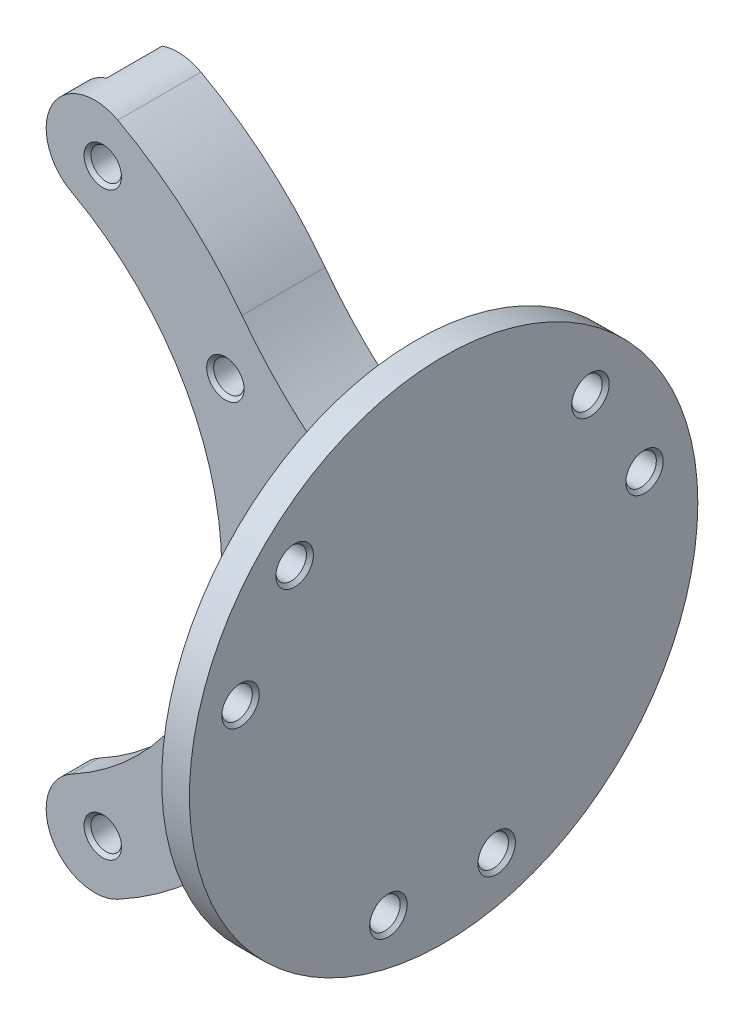
ISO-10303-21;
HEADER;
FILE_DESCRIPTION(('STEP AP214'),'2;1');
FILE_NAME('part.step','',(''),(''),'','','');
FILE_SCHEMA(('AUTOMOTIVE_DESIGN { 1 0 10303 214 1 1 1 1 }'));
ENDSEC;
DATA;
#1=APPLICATION_CONTEXT('core data for automotive mechanical design processes');
#2=APPLICATION_PROTOCOL_DEFINITION('international standard','automotive_design',2000,#1);
#3=PRODUCT_CONTEXT('',#1,'mechanical');
#4=PRODUCT('Part','Part','',(#3));
#5=PRODUCT_RELATED_PRODUCT_CATEGORY('part','',(#4));
#6=PRODUCT_DEFINITION_FORMATION('','',#4);
#7=PRODUCT_DEFINITION_CONTEXT('part definition',#1,'design');
#8=PRODUCT_DEFINITION('design','',#6,#7);
#9=PRODUCT_DEFINITION_SHAPE('','',#8);
#10=(LENGTH_UNIT() NAMED_UNIT(*) SI_UNIT(.MILLI.,.METRE.));
#11=(NAMED_UNIT(*) PLANE_ANGLE_UNIT() SI_UNIT($,.RADIAN.));
#12=(NAMED_UNIT(*) SI_UNIT($,.STERADIAN.) SOLID_ANGLE_UNIT());
#13=UNCERTAINTY_MEASURE_WITH_UNIT(LENGTH_MEASURE(1.E-05),#10,'distance_accuracy_value','');
#14=(GEOMETRIC_REPRESENTATION_CONTEXT(3) GLOBAL_UNCERTAINTY_ASSIGNED_CONTEXT((#13)) GLOBAL_UNIT_ASSIGNED_CONTEXT((#10,
#11,#12)) REPRESENTATION_CONTEXT('',''));
#15=CARTESIAN_POINT('',(0.,0.,0.));
#16=DIRECTION('',(0.,0.,1.));
#17=DIRECTION('',(1.,0.,0.));
#18=AXIS2_PLACEMENT_3D('',#15,#16,#17);
#19=CARTESIAN_POINT('',(0.,0.,3.));
#20=DIRECTION('',(0.,0.,-1.));
#21=DIRECTION('',(-1.,0.,0.));
#22=AXIS2_PLACEMENT_3D('',#19,#20,#21);
#23=CYLINDRICAL_SURFACE('',#22,41.5);
#24=DIRECTION('',(0.,0.,1.));
#25=VECTOR('',#24,1.);
#26=CARTESIAN_POINT('',(33.1863891259891,24.9181375062095,-6.));
#27=LINE('',#26,#25);
#28=CARTESIAN_POINT('',(33.1863891259891,24.9181375062095,-6.));
#29=VERTEX_POINT('',#28);
#30=CARTESIAN_POINT('',(33.1863891259898,24.9181375062099,3.));
#31=VERTEX_POINT('',#30);
#32=EDGE_CURVE('E151',#29,#31,#27,.T.);
#33=ORIENTED_EDGE('',*,*,#32,.F.);
#34=CARTESIAN_POINT('',(0.,0.,-6.));
#35=DIRECTION('',(0.,0.,1.));
#36=DIRECTION('',(1.,0.,0.));
#37=AXIS2_PLACEMENT_3D('',#34,#35,#36);
#38=CIRCLE('',#37,41.5);
#39=CARTESIAN_POINT('',(19.7507491807269,36.498738427513,-6.));
#40=VERTEX_POINT('',#39);
#41=EDGE_CURVE('E160',#29,#40,#38,.T.);
#42=ORIENTED_EDGE('',*,*,#41,.T.);
#43=DIRECTION('',(0.,0.,-1.));
#44=VECTOR('',#43,1.);
#45=CARTESIAN_POINT('',(19.7507491807269,36.498738427513,3.));
#46=LINE('',#45,#44);
#47=CARTESIAN_POINT('',(19.7507491807269,36.498738427513,3.));
#48=VERTEX_POINT('',#47);
#49=EDGE_CURVE('E276',#48,#40,#46,.T.);
#50=ORIENTED_EDGE('',*,*,#49,.F.);
#51=CARTESIAN_POINT('',(0.,0.,3.));
#52=DIRECTION('',(0.,0.,1.));
#53=DIRECTION('',(1.,0.,0.));
#54=AXIS2_PLACEMENT_3D('',#51,#52,#53);
#55=CIRCLE('',#54,41.5);
#56=EDGE_CURVE('E172',#31,#48,#55,.T.);
#57=ORIENTED_EDGE('',*,*,#56,.F.);
#58=EDGE_LOOP('',(#33,#42,#50,#57));
#59=FACE_BOUND('',#58,.T.);
#60=ADVANCED_FACE('F45',(#59),#23,.T.);
#61=CARTESIAN_POINT('',(0.,0.,0.));
#62=DIRECTION('',(0.,0.,1.));
#63=DIRECTION('',(1.,0.,0.));
#64=AXIS2_PLACEMENT_3D('',#61,#62,#63);
#65=PLANE('',#64);
#66=CARTESIAN_POINT('',(31.3934208871861,18.1249999999996,0.));
#67=DIRECTION('',(0.,0.,1.));
#68=DIRECTION('',(1.,0.,0.));
#69=AXIS2_PLACEMENT_3D('',#66,#67,#68);
#70=CIRCLE('',#69,1.65);
#71=CARTESIAN_POINT('',(33.0434208871861,18.1249999999996,0.));
#72=VERTEX_POINT('',#71);
#73=EDGE_CURVE('E189',#72,#72,#70,.T.);
#74=ORIENTED_EDGE('',*,*,#73,.T.);
#75=EDGE_LOOP('',(#74));
#76=FACE_BOUND('',#75,.T.);
#77=CARTESIAN_POINT('',(18.1250000000004,31.3934208871857,0.));
#78=DIRECTION('',(0.,0.,1.));
#79=DIRECTION('',(1.,0.,0.));
#80=AXIS2_PLACEMENT_3D('',#77,#78,#79);
#81=CIRCLE('',#80,1.64999999999999);
#82=CARTESIAN_POINT('',(19.7750000000004,31.3934208871857,0.));
#83=VERTEX_POINT('',#82);
#84=EDGE_CURVE('E198',#83,#83,#81,.T.);
#85=ORIENTED_EDGE('',*,*,#84,.T.);
#86=EDGE_LOOP('',(#85));
#87=FACE_BOUND('',#86,.T.);
#88=CARTESIAN_POINT('',(18.1249999999999,-31.3934208871859,0.));
#89=DIRECTION('',(0.,0.,1.));
#90=DIRECTION('',(1.,0.,0.));
#91=AXIS2_PLACEMENT_3D('',#88,#89,#90);
#92=CIRCLE('',#91,1.65);
#93=CARTESIAN_POINT('',(19.7749999999999,-31.3934208871859,0.));
#94=VERTEX_POINT('',#93);
#95=EDGE_CURVE('E207',#94,#94,#92,.T.);
#96=ORIENTED_EDGE('',*,*,#95,.T.);
#97=EDGE_LOOP('',(#96));
#98=FACE_BOUND('',#97,.T.);
#99=CARTESIAN_POINT('',(31.3934208871859,-18.125,0.));
#100=DIRECTION('',(0.,0.,1.));
#101=DIRECTION('',(1.,0.,0.));
#102=AXIS2_PLACEMENT_3D('',#99,#100,#101);
#103=CIRCLE('',#102,1.65);
#104=CARTESIAN_POINT('',(33.0434208871859,-18.125,0.));
#105=VERTEX_POINT('',#104);
#106=EDGE_CURVE('E216',#105,#105,#103,.T.);
#107=ORIENTED_EDGE('',*,*,#106,.T.);
#108=EDGE_LOOP('',(#107));
#109=FACE_BOUND('',#108,.T.);
#110=CARTESIAN_POINT('',(36.25,0.,0.));
#111=DIRECTION('',(0.,0.,1.));
#112=DIRECTION('',(1.,0.,0.));
#113=AXIS2_PLACEMENT_3D('',#110,#111,#112);
#114=CIRCLE('',#113,1.65);
#115=CARTESIAN_POINT('',(37.9,0.,0.));
#116=VERTEX_POINT('',#115);
#117=EDGE_CURVE('E225',#116,#116,#114,.T.);
#118=ORIENTED_EDGE('',*,*,#117,.T.);
#119=EDGE_LOOP('',(#118));
#120=FACE_BOUND('',#119,.T.);
#121=CARTESIAN_POINT('',(0.,0.,0.));
#122=DIRECTION('',(0.,0.,1.));
#123=DIRECTION('',(1.,0.,0.));
#124=AXIS2_PLACEMENT_3D('',#121,#122,#123);
#125=CIRCLE('',#124,40.);
#126=CARTESIAN_POINT('',(15.557724421526,-36.8504709715338,0.));
#127=VERTEX_POINT('',#126);
#128=CARTESIAN_POINT('',(15.5577244215262,36.8504709715337,0.));
#129=VERTEX_POINT('',#128);
#130=EDGE_CURVE('E229',#127,#129,#125,.T.);
#131=ORIENTED_EDGE('',*,*,#130,.F.);
#132=CARTESIAN_POINT('',(17.252160428948,-31.8814281445145,0.));
#133=DIRECTION('',(0.,0.,1.));
#134=DIRECTION('',(1.,0.,0.));
#135=AXIS2_PLACEMENT_3D('',#132,#133,#134);
#136=CIRCLE('',#135,5.25);
#137=CARTESIAN_POINT('',(14.7535716771693,-27.2641178615158,0.));
#138=VERTEX_POINT('',#137);
#139=EDGE_CURVE('E268',#138,#127,#136,.T.);
#140=ORIENTED_EDGE('',*,*,#139,.F.);
#141=CARTESIAN_POINT('',(0.,0.,0.));
#142=DIRECTION('',(0.,0.,1.));
#143=DIRECTION('',(1.,0.,0.));
#144=AXIS2_PLACEMENT_3D('',#141,#142,#143);
#145=CIRCLE('',#144,31.);
#146=CARTESIAN_POINT('',(14.7535716771695,27.2641178615158,0.));
#147=VERTEX_POINT('',#146);
#148=EDGE_CURVE('E244',#138,#147,#145,.T.);
#149=ORIENTED_EDGE('',*,*,#148,.T.);
#150=CARTESIAN_POINT('',(17.2521604289482,31.8814281445144,0.));
#151=DIRECTION('',(0.,0.,1.));
#152=DIRECTION('',(1.,0.,0.));
#153=AXIS2_PLACEMENT_3D('',#150,#151,#152);
#154=CIRCLE('',#153,5.25);
#155=EDGE_CURVE('E253',#147,#129,#154,.F.);
#156=ORIENTED_EDGE('',*,*,#155,.T.);
#157=EDGE_LOOP('',(#131,#140,#149,#156));
#158=FACE_BOUND('',#157,.T.);
#159=ADVANCED_FACE('F464',(#76,#87,#98,#109,#120,#158),#65,.F.);
#160=CARTESIAN_POINT('',(0.,0.,3.));
#161=DIRECTION('',(0.,0.,-1.));
#162=DIRECTION('',(-1.,0.,0.));
#163=AXIS2_PLACEMENT_3D('',#160,#161,#162);
#164=CYLINDRICAL_SURFACE('',#163,31.);
#165=ORIENTED_EDGE('',*,*,#148,.F.);
#166=DIRECTION('',(0.,0.,-1.));
#167=VECTOR('',#166,1.);
#168=CARTESIAN_POINT('',(14.7535716771693,-27.2641178615158,3.));
#169=LINE('',#168,#167);
#170=CARTESIAN_POINT('',(14.7535716771693,-27.2641178615158,3.));
#171=VERTEX_POINT('',#170);
#172=EDGE_CURVE('E282',#171,#138,#169,.T.);
#173=ORIENTED_EDGE('',*,*,#172,.F.);
#174=CARTESIAN_POINT('',(0.,0.,3.));
#175=DIRECTION('',(0.,0.,1.));
#176=DIRECTION('',(1.,0.,0.));
#177=AXIS2_PLACEMENT_3D('',#174,#175,#176);
#178=CIRCLE('',#177,31.);
#179=CARTESIAN_POINT('',(14.7535716771695,27.2641178615158,3.));
#180=VERTEX_POINT('',#179);
#181=EDGE_CURVE('E248',#171,#180,#178,.T.);
#182=ORIENTED_EDGE('',*,*,#181,.T.);
#183=DIRECTION('',(0.,0.,-1.));
#184=VECTOR('',#183,1.);
#185=CARTESIAN_POINT('',(14.7535716771695,27.2641178615158,3.));
#186=LINE('',#185,#184);
#187=EDGE_CURVE('E264',#180,#147,#186,.T.);
#188=ORIENTED_EDGE('',*,*,#187,.T.);
#189=EDGE_LOOP('',(#165,#173,#182,#188));
#190=FACE_BOUND('',#189,.T.);
#191=ADVANCED_FACE('F470',(#190),#164,.F.);
#192=CARTESIAN_POINT('',(17.252160428948,-31.8814281445145,3.));
#193=DIRECTION('',(0.,0.,-1.));
#194=DIRECTION('',(-1.,0.,0.));
#195=AXIS2_PLACEMENT_3D('',#192,#193,#194);
#196=CYLINDRICAL_SURFACE('',#195,5.25);
#197=ORIENTED_EDGE('',*,*,#139,.T.);
#198=DIRECTION('',(0.,0.,1.));
#199=VECTOR('',#198,1.);
#200=CARTESIAN_POINT('',(15.557724421526,-36.8504709715338,-6.));
#201=LINE('',#200,#199);
#202=CARTESIAN_POINT('',(15.557724421526,-36.8504709715338,-6.));
#203=VERTEX_POINT('',#202);
#204=EDGE_CURVE('E236',#203,#127,#201,.T.);
#205=ORIENTED_EDGE('',*,*,#204,.F.);
#206=CARTESIAN_POINT('',(17.252160428948,-31.8814281445145,-6.));
#207=DIRECTION('',(0.,0.,1.));
#208=DIRECTION('',(1.,0.,0.));
#209=AXIS2_PLACEMENT_3D('',#206,#207,#208);
#210=CIRCLE('',#209,5.25);
#211=CARTESIAN_POINT('',(19.7507491807267,-36.4987384275131,-6.));
#212=VERTEX_POINT('',#211);
#213=EDGE_CURVE('E169',#203,#212,#210,.T.);
#214=ORIENTED_EDGE('',*,*,#213,.T.);
#215=DIRECTION('',(0.,0.,-1.));
#216=VECTOR('',#215,1.);
#217=CARTESIAN_POINT('',(19.7507491807267,-36.4987384275131,3.));
#218=LINE('',#217,#216);
#219=CARTESIAN_POINT('',(19.7507491807267,-36.4987384275131,3.));
#220=VERTEX_POINT('',#219);
#221=EDGE_CURVE('E279',#220,#212,#218,.T.);
#222=ORIENTED_EDGE('',*,*,#221,.F.);
#223=CARTESIAN_POINT('',(17.252160428948,-31.8814281445145,3.));
#224=DIRECTION('',(0.,0.,1.));
#225=DIRECTION('',(1.,0.,0.));
#226=AXIS2_PLACEMENT_3D('',#223,#224,#225);
#227=CIRCLE('',#226,5.25);
#228=EDGE_CURVE('E252',#171,#220,#227,.T.);
#229=ORIENTED_EDGE('',*,*,#228,.F.);
#230=ORIENTED_EDGE('',*,*,#172,.T.);
#231=EDGE_LOOP('',(#197,#205,#214,#222,#229,#230));
#232=FACE_BOUND('',#231,.T.);
#233=ADVANCED_FACE('F477',(#232),#196,.T.);
#234=CARTESIAN_POINT('',(33.1863891259897,-24.91813750621,-6.));
#235=VERTEX_POINT('',#234);
#236=EDGE_CURVE('E168',#212,#235,#38,.T.);
#237=ORIENTED_EDGE('',*,*,#236,.T.);
#238=DIRECTION('',(0.,0.,1.));
#239=VECTOR('',#238,1.);
#240=CARTESIAN_POINT('',(33.1863891259891,-24.9181375062095,-6.));
#241=LINE('',#240,#239);
#242=CARTESIAN_POINT('',(33.1863891259897,-24.91813750621,3.));
#243=VERTEX_POINT('',#242);
#244=EDGE_CURVE('E156',#235,#243,#241,.T.);
#245=ORIENTED_EDGE('',*,*,#244,.T.);
#246=EDGE_CURVE('E256',#220,#243,#55,.T.);
#247=ORIENTED_EDGE('',*,*,#246,.F.);
#248=ORIENTED_EDGE('',*,*,#221,.T.);
#249=EDGE_LOOP('',(#237,#245,#247,#248));
#250=FACE_BOUND('',#249,.T.);
#251=ADVANCED_FACE('F466',(#250),#23,.T.);
#252=CARTESIAN_POINT('',(17.2521604289482,31.8814281445144,3.));
#253=DIRECTION('',(0.,0.,-1.));
#254=DIRECTION('',(-1.,0.,0.));
#255=AXIS2_PLACEMENT_3D('',#252,#253,#254);
#256=CYLINDRICAL_SURFACE('',#255,5.25);
#257=ORIENTED_EDGE('',*,*,#155,.F.);
#258=ORIENTED_EDGE('',*,*,#187,.F.);
#259=CARTESIAN_POINT('',(17.2521604289482,31.8814281445144,3.));
#260=DIRECTION('',(0.,0.,1.));
#261=DIRECTION('',(1.,0.,0.));
#262=AXIS2_PLACEMENT_3D('',#259,#260,#261);
#263=CIRCLE('',#262,5.25);
#264=EDGE_CURVE('E260',#180,#48,#263,.F.);
#265=ORIENTED_EDGE('',*,*,#264,.T.);
#266=ORIENTED_EDGE('',*,*,#49,.T.);
#267=CARTESIAN_POINT('',(17.2521604289482,31.8814281445144,-6.));
#268=DIRECTION('',(0.,0.,1.));
#269=DIRECTION('',(1.,0.,0.));
#270=AXIS2_PLACEMENT_3D('',#267,#268,#269);
#271=CIRCLE('',#270,5.25);
#272=CARTESIAN_POINT('',(15.5577244215262,36.8504709715337,-6.));
#273=VERTEX_POINT('',#272);
#274=EDGE_CURVE('E163',#273,#40,#271,.F.);
#275=ORIENTED_EDGE('',*,*,#274,.F.);
#276=DIRECTION('',(0.,0.,1.));
#277=VECTOR('',#276,1.);
#278=CARTESIAN_POINT('',(15.5577244215262,36.8504709715337,-6.));
#279=LINE('',#278,#277);
#280=EDGE_CURVE('E240',#273,#129,#279,.T.);
#281=ORIENTED_EDGE('',*,*,#280,.T.);
#282=EDGE_LOOP('',(#257,#258,#265,#266,#275,#281));
#283=FACE_BOUND('',#282,.T.);
#284=ADVANCED_FACE('F476',(#283),#256,.T.);
#285=CARTESIAN_POINT('',(0.,0.,3.));
#286=DIRECTION('',(0.,0.,1.));
#287=DIRECTION('',(1.,0.,0.));
#288=AXIS2_PLACEMENT_3D('',#285,#286,#287);
#289=PLANE('',#288);
#290=CARTESIAN_POINT('',(31.3934208871861,18.1249999999996,3.));
#291=DIRECTION('',(0.,0.,1.));
#292=DIRECTION('',(1.,0.,0.));
#293=AXIS2_PLACEMENT_3D('',#290,#291,#292);
#294=CIRCLE('',#293,2.025);
#295=CARTESIAN_POINT('',(33.4184208871861,18.1249999999996,3.));
#296=VERTEX_POINT('',#295);
#297=EDGE_CURVE('E174',#296,#296,#294,.T.);
#298=ORIENTED_EDGE('',*,*,#297,.F.);
#299=EDGE_LOOP('',(#298));
#300=FACE_BOUND('',#299,.T.);
#301=CARTESIAN_POINT('',(18.1250000000004,31.3934208871857,3.));
#302=DIRECTION('',(0.,0.,1.));
#303=DIRECTION('',(1.,0.,0.));
#304=AXIS2_PLACEMENT_3D('',#301,#302,#303);
#305=CIRCLE('',#304,2.025);
#306=CARTESIAN_POINT('',(20.1500000000004,31.3934208871857,3.));
#307=VERTEX_POINT('',#306);
#308=EDGE_CURVE('E190',#307,#307,#305,.T.);
#309=ORIENTED_EDGE('',*,*,#308,.F.);
#310=EDGE_LOOP('',(#309));
#311=FACE_BOUND('',#310,.T.);
#312=CARTESIAN_POINT('',(18.1249999999999,-31.3934208871859,3.));
#313=DIRECTION('',(0.,0.,1.));
#314=DIRECTION('',(1.,0.,0.));
#315=AXIS2_PLACEMENT_3D('',#312,#313,#314);
#316=CIRCLE('',#315,2.025);
#317=CARTESIAN_POINT('',(20.1499999999999,-31.3934208871859,3.));
#318=VERTEX_POINT('',#317);
#319=EDGE_CURVE('E199',#318,#318,#316,.T.);
#320=ORIENTED_EDGE('',*,*,#319,.F.);
#321=EDGE_LOOP('',(#320));
#322=FACE_BOUND('',#321,.T.);
#323=CARTESIAN_POINT('',(31.3934208871859,-18.125,3.));
#324=DIRECTION('',(0.,0.,1.));
#325=DIRECTION('',(1.,0.,0.));
#326=AXIS2_PLACEMENT_3D('',#323,#324,#325);
#327=CIRCLE('',#326,2.025);
#328=CARTESIAN_POINT('',(33.4184208871859,-18.125,3.));
#329=VERTEX_POINT('',#328);
#330=EDGE_CURVE('E208',#329,#329,#327,.T.);
#331=ORIENTED_EDGE('',*,*,#330,.F.);
#332=EDGE_LOOP('',(#331));
#333=FACE_BOUND('',#332,.T.);
#334=CARTESIAN_POINT('',(36.25,0.,3.));
#335=DIRECTION('',(0.,0.,1.));
#336=DIRECTION('',(1.,0.,0.));
#337=AXIS2_PLACEMENT_3D('',#334,#335,#336);
#338=CIRCLE('',#337,2.025);
#339=CARTESIAN_POINT('',(38.275,0.,3.));
#340=VERTEX_POINT('',#339);
#341=EDGE_CURVE('E217',#340,#340,#338,.T.);
#342=ORIENTED_EDGE('',*,*,#341,.F.);
#343=EDGE_LOOP('',(#342));
#344=FACE_BOUND('',#343,.T.);
#345=CARTESIAN_POINT('',(69.1716303469425,-51.9378046816184,3.));
#346=DIRECTION('',(0.,0.,-1.));
#347=DIRECTION('',(-1.,0.,0.));
#348=AXIS2_PLACEMENT_3D('',#345,#346,#347);
#349=CIRCLE('',#348,45.0000000000009);
#350=CARTESIAN_POINT('',(42.7377406895115,-15.5200963849829,3.));
#351=VERTEX_POINT('',#350);
#352=EDGE_CURVE('E428',#243,#351,#349,.T.);
#353=ORIENTED_EDGE('',*,*,#352,.T.);
#354=CARTESIAN_POINT('',(44.5000000000068,-17.9479436047585,3.));
#355=DIRECTION('',(0.,0.,1.));
#356=DIRECTION('',(1.,0.,0.));
#357=AXIS2_PLACEMENT_3D('',#354,#355,#356);
#358=CIRCLE('',#357,3.);
#359=CARTESIAN_POINT('',(44.5000000000068,-14.9479436047585,3.));
#360=VERTEX_POINT('',#359);
#361=EDGE_CURVE('E359',#351,#360,#358,.F.);
#362=ORIENTED_EDGE('',*,*,#361,.T.);
#363=DIRECTION('',(0.,1.,0.));
#364=VECTOR('',#363,1.);
#365=CARTESIAN_POINT('',(44.5000000000068,0.,3.));
#366=LINE('',#365,#364);
#367=CARTESIAN_POINT('',(44.5000000000068,14.9479436047585,3.));
#368=VERTEX_POINT('',#367);
#369=EDGE_CURVE('E285',#360,#368,#366,.T.);
#370=ORIENTED_EDGE('',*,*,#369,.T.);
#371=CARTESIAN_POINT('',(44.5000000000068,17.9479436047585,3.));
#372=DIRECTION('',(0.,0.,1.));
#373=DIRECTION('',(1.,0.,0.));
#374=AXIS2_PLACEMENT_3D('',#371,#372,#373);
#375=CIRCLE('',#374,3.);
#376=CARTESIAN_POINT('',(42.7377406895114,15.5200963849829,3.));
#377=VERTEX_POINT('',#376);
#378=EDGE_CURVE('E55',#368,#377,#375,.F.);
#379=ORIENTED_EDGE('',*,*,#378,.T.);
#380=CARTESIAN_POINT('',(69.1716303469426,51.9378046816183,3.));
#381=DIRECTION('',(0.,0.,-1.));
#382=DIRECTION('',(1.,0.,0.));
#383=AXIS2_PLACEMENT_3D('',#380,#381,#382);
#384=CIRCLE('',#383,45.0000000000009);
#385=EDGE_CURVE('E183',#377,#31,#384,.T.);
#386=ORIENTED_EDGE('',*,*,#385,.T.);
#387=ORIENTED_EDGE('',*,*,#56,.T.);
#388=ORIENTED_EDGE('',*,*,#264,.F.);
#389=ORIENTED_EDGE('',*,*,#181,.F.);
#390=ORIENTED_EDGE('',*,*,#228,.T.);
#391=ORIENTED_EDGE('',*,*,#246,.T.);
#392=EDGE_LOOP('',(#353,#362,#370,#379,#386,#387,#388,#389,#390,#391));
#393=FACE_BOUND('',#392,.T.);
#394=ADVANCED_FACE('F440',(#300,#311,#322,#333,#344,#393),#289,.T.);
#395=CARTESIAN_POINT('',(0.,0.,-6.));
#396=DIRECTION('',(0.,0.,1.));
#397=DIRECTION('',(1.,0.,0.));
#398=AXIS2_PLACEMENT_3D('',#395,#396,#397);
#399=CYLINDRICAL_SURFACE('',#398,40.);
#400=ORIENTED_EDGE('',*,*,#130,.T.);
#401=ORIENTED_EDGE('',*,*,#280,.F.);
#402=CARTESIAN_POINT('',(0.,0.,-6.));
#403=DIRECTION('',(0.,0.,1.));
#404=DIRECTION('',(1.,0.,0.));
#405=AXIS2_PLACEMENT_3D('',#402,#403,#404);
#406=CIRCLE('',#405,40.);
#407=EDGE_CURVE('E226',#203,#273,#406,.T.);
#408=ORIENTED_EDGE('',*,*,#407,.F.);
#409=ORIENTED_EDGE('',*,*,#204,.T.);
#410=EDGE_LOOP('',(#400,#401,#408,#409));
#411=FACE_BOUND('',#410,.T.);
#412=ADVANCED_FACE('F549',(#411),#399,.F.);
#413=CARTESIAN_POINT('',(0.,0.,-6.));
#414=DIRECTION('',(0.,0.,1.));
#415=DIRECTION('',(1.,0.,0.));
#416=AXIS2_PLACEMENT_3D('',#413,#414,#415);
#417=PLANE('',#416);
#418=CARTESIAN_POINT('',(69.1716303469426,51.9378046816183,-6.));
#419=DIRECTION('',(0.,0.,-1.));
#420=DIRECTION('',(1.,0.,0.));
#421=AXIS2_PLACEMENT_3D('',#418,#419,#420);
#422=CIRCLE('',#421,45.0000000000009);
#423=CARTESIAN_POINT('',(42.7377406895114,15.5200963849829,-6.));
#424=VERTEX_POINT('',#423);
#425=EDGE_CURVE('E146',#424,#29,#422,.T.);
#426=ORIENTED_EDGE('',*,*,#425,.F.);
#427=CARTESIAN_POINT('',(44.5000000000068,17.9479436047585,-6.));
#428=DIRECTION('',(0.,0.,1.));
#429=DIRECTION('',(1.,0.,0.));
#430=AXIS2_PLACEMENT_3D('',#427,#428,#429);
#431=CIRCLE('',#430,3.);
#432=CARTESIAN_POINT('',(44.5000000000068,14.9479436047585,-6.));
#433=VERTEX_POINT('',#432);
#434=EDGE_CURVE('E11',#424,#433,#431,.T.);
#435=ORIENTED_EDGE('',*,*,#434,.T.);
#436=DIRECTION('',(0.,1.,0.));
#437=VECTOR('',#436,1.);
#438=CARTESIAN_POINT('',(44.5000000000068,-12.4999999999943,-6.));
#439=LINE('',#438,#437);
#440=CARTESIAN_POINT('',(44.5000000000068,-14.9479436047585,-6.));
#441=VERTEX_POINT('',#440);
#442=EDGE_CURVE('E63',#433,#441,#439,.F.);
#443=ORIENTED_EDGE('',*,*,#442,.T.);
#444=CARTESIAN_POINT('',(44.5000000000068,-17.9479436047585,-6.));
#445=DIRECTION('',(0.,0.,1.));
#446=DIRECTION('',(1.,0.,0.));
#447=AXIS2_PLACEMENT_3D('',#444,#445,#446);
#448=CIRCLE('',#447,3.);
#449=CARTESIAN_POINT('',(42.7377406895114,-15.5200963849829,-6.));
#450=VERTEX_POINT('',#449);
#451=EDGE_CURVE('E363',#441,#450,#448,.T.);
#452=ORIENTED_EDGE('',*,*,#451,.T.);
#453=CARTESIAN_POINT('',(69.1716303469425,-51.9378046816184,-6.));
#454=DIRECTION('',(0.,0.,-1.));
#455=DIRECTION('',(-1.,0.,0.));
#456=AXIS2_PLACEMENT_3D('',#453,#454,#455);
#457=CIRCLE('',#456,45.0000000000009);
#458=EDGE_CURVE('E157',#235,#450,#457,.T.);
#459=ORIENTED_EDGE('',*,*,#458,.F.);
#460=ORIENTED_EDGE('',*,*,#236,.F.);
#461=ORIENTED_EDGE('',*,*,#213,.F.);
#462=ORIENTED_EDGE('',*,*,#407,.T.);
#463=ORIENTED_EDGE('',*,*,#274,.T.);
#464=ORIENTED_EDGE('',*,*,#41,.F.);
#465=EDGE_LOOP('',(#426,#435,#443,#452,#459,#460,#461,#462,#463,#464));
#466=FACE_BOUND('',#465,.T.);
#467=ADVANCED_FACE('F161',(#466),#417,.F.);
#468=CARTESIAN_POINT('',(36.25,0.,3.));
#469=DIRECTION('',(0.,0.,1.));
#470=DIRECTION('',(1.,0.,0.));
#471=AXIS2_PLACEMENT_3D('',#468,#469,#470);
#472=CYLINDRICAL_SURFACE('',#471,1.65);
#473=CARTESIAN_POINT('',(36.25,0.,2.625));
#474=DIRECTION('',(0.,0.,1.));
#475=DIRECTION('',(1.,0.,0.));
#476=AXIS2_PLACEMENT_3D('',#473,#474,#475);
#477=CIRCLE('',#476,1.64999999999999);
#478=CARTESIAN_POINT('',(37.9,0.,2.625));
#479=VERTEX_POINT('',#478);
#480=EDGE_CURVE('E221',#479,#479,#477,.T.);
#481=ORIENTED_EDGE('',*,*,#480,.T.);
#482=EDGE_LOOP('',(#481));
#483=FACE_BOUND('',#482,.T.);
#484=ORIENTED_EDGE('',*,*,#117,.F.);
#485=EDGE_LOOP('',(#484));
#486=FACE_BOUND('',#485,.T.);
#487=ADVANCED_FACE('F542',(#483,#486),#472,.F.);
#488=CARTESIAN_POINT('',(36.25,0.,3.));
#489=DIRECTION('',(0.,0.,1.));
#490=DIRECTION('',(1.,0.,0.));
#491=AXIS2_PLACEMENT_3D('',#488,#489,#490);
#492=CONICAL_SURFACE('',#491,2.025,0.785398163397455);
#493=ORIENTED_EDGE('',*,*,#480,.F.);
#494=EDGE_LOOP('',(#493));
#495=FACE_BOUND('',#494,.T.);
#496=ORIENTED_EDGE('',*,*,#341,.T.);
#497=EDGE_LOOP('',(#496));
#498=FACE_BOUND('',#497,.T.);
#499=ADVANCED_FACE('F538',(#495,#498),#492,.F.);
#500=CARTESIAN_POINT('',(31.3934208871859,-18.125,3.));
#501=DIRECTION('',(0.,0.,1.));
#502=DIRECTION('',(1.,0.,0.));
#503=AXIS2_PLACEMENT_3D('',#500,#501,#502);
#504=CYLINDRICAL_SURFACE('',#503,1.65);
#505=CARTESIAN_POINT('',(31.3934208871859,-18.125,2.625));
#506=DIRECTION('',(0.,0.,1.));
#507=DIRECTION('',(1.,0.,0.));
#508=AXIS2_PLACEMENT_3D('',#505,#506,#507);
#509=CIRCLE('',#508,1.64999999999999);
#510=CARTESIAN_POINT('',(33.0434208871859,-18.125,2.625));
#511=VERTEX_POINT('',#510);
#512=EDGE_CURVE('E212',#511,#511,#509,.T.);
#513=ORIENTED_EDGE('',*,*,#512,.T.);
#514=EDGE_LOOP('',(#513));
#515=FACE_BOUND('',#514,.T.);
#516=ORIENTED_EDGE('',*,*,#106,.F.);
#517=EDGE_LOOP('',(#516));
#518=FACE_BOUND('',#517,.T.);
#519=ADVANCED_FACE('F534',(#515,#518),#504,.F.);
#520=CARTESIAN_POINT('',(31.3934208871859,-18.125,3.));
#521=DIRECTION('',(0.,0.,1.));
#522=DIRECTION('',(1.,0.,0.));
#523=AXIS2_PLACEMENT_3D('',#520,#521,#522);
#524=CONICAL_SURFACE('',#523,2.025,0.785398163397455);
#525=ORIENTED_EDGE('',*,*,#512,.F.);
#526=EDGE_LOOP('',(#525));
#527=FACE_BOUND('',#526,.T.);
#528=ORIENTED_EDGE('',*,*,#330,.T.);
#529=EDGE_LOOP('',(#528));
#530=FACE_BOUND('',#529,.T.);
#531=ADVANCED_FACE('F530',(#527,#530),#524,.F.);
#532=CARTESIAN_POINT('',(18.1249999999999,-31.3934208871859,3.));
#533=DIRECTION('',(0.,0.,1.));
#534=DIRECTION('',(1.,0.,0.));
#535=AXIS2_PLACEMENT_3D('',#532,#533,#534);
#536=CYLINDRICAL_SURFACE('',#535,1.65);
#537=CARTESIAN_POINT('',(18.1249999999999,-31.3934208871859,2.625));
#538=DIRECTION('',(0.,0.,1.));
#539=DIRECTION('',(1.,0.,0.));
#540=AXIS2_PLACEMENT_3D('',#537,#538,#539);
#541=CIRCLE('',#540,1.64999999999999);
#542=CARTESIAN_POINT('',(19.7749999999999,-31.3934208871859,2.625));
#543=VERTEX_POINT('',#542);
#544=EDGE_CURVE('E203',#543,#543,#541,.T.);
#545=ORIENTED_EDGE('',*,*,#544,.T.);
#546=EDGE_LOOP('',(#545));
#547=FACE_BOUND('',#546,.T.);
#548=ORIENTED_EDGE('',*,*,#95,.F.);
#549=EDGE_LOOP('',(#548));
#550=FACE_BOUND('',#549,.T.);
#551=ADVANCED_FACE('F526',(#547,#550),#536,.F.);
#552=CARTESIAN_POINT('',(18.1249999999999,-31.3934208871859,3.));
#553=DIRECTION('',(0.,0.,1.));
#554=DIRECTION('',(1.,0.,0.));
#555=AXIS2_PLACEMENT_3D('',#552,#553,#554);
#556=CONICAL_SURFACE('',#555,2.025,0.785398163397455);
#557=ORIENTED_EDGE('',*,*,#544,.F.);
#558=EDGE_LOOP('',(#557));
#559=FACE_BOUND('',#558,.T.);
#560=ORIENTED_EDGE('',*,*,#319,.T.);
#561=EDGE_LOOP('',(#560));
#562=FACE_BOUND('',#561,.T.);
#563=ADVANCED_FACE('F522',(#559,#562),#556,.F.);
#564=CARTESIAN_POINT('',(18.1250000000004,31.3934208871857,3.));
#565=DIRECTION('',(0.,0.,1.));
#566=DIRECTION('',(1.,0.,0.));
#567=AXIS2_PLACEMENT_3D('',#564,#565,#566);
#568=CYLINDRICAL_SURFACE('',#567,1.64999999999999);
#569=CARTESIAN_POINT('',(18.1250000000004,31.3934208871857,2.625));
#570=DIRECTION('',(0.,0.,1.));
#571=DIRECTION('',(1.,0.,0.));
#572=AXIS2_PLACEMENT_3D('',#569,#570,#571);
#573=CIRCLE('',#572,1.64999999999999);
#574=CARTESIAN_POINT('',(19.7750000000004,31.3934208871857,2.625));
#575=VERTEX_POINT('',#574);
#576=EDGE_CURVE('E194',#575,#575,#573,.T.);
#577=ORIENTED_EDGE('',*,*,#576,.T.);
#578=EDGE_LOOP('',(#577));
#579=FACE_BOUND('',#578,.T.);
#580=ORIENTED_EDGE('',*,*,#84,.F.);
#581=EDGE_LOOP('',(#580));
#582=FACE_BOUND('',#581,.T.);
#583=ADVANCED_FACE('F518',(#579,#582),#568,.F.);
#584=CARTESIAN_POINT('',(18.1250000000004,31.3934208871857,3.));
#585=DIRECTION('',(0.,0.,1.));
#586=DIRECTION('',(1.,0.,0.));
#587=AXIS2_PLACEMENT_3D('',#584,#585,#586);
#588=CONICAL_SURFACE('',#587,2.025,0.78539816339746);
#589=ORIENTED_EDGE('',*,*,#576,.F.);
#590=EDGE_LOOP('',(#589));
#591=FACE_BOUND('',#590,.T.);
#592=ORIENTED_EDGE('',*,*,#308,.T.);
#593=EDGE_LOOP('',(#592));
#594=FACE_BOUND('',#593,.T.);
#595=ADVANCED_FACE('F514',(#591,#594),#588,.F.);
#596=CARTESIAN_POINT('',(31.3934208871861,18.1249999999996,3.));
#597=DIRECTION('',(0.,0.,1.));
#598=DIRECTION('',(1.,0.,0.));
#599=AXIS2_PLACEMENT_3D('',#596,#597,#598);
#600=CYLINDRICAL_SURFACE('',#599,1.65);
#601=CARTESIAN_POINT('',(31.3934208871861,18.1249999999996,2.625));
#602=DIRECTION('',(0.,0.,1.));
#603=DIRECTION('',(1.,0.,0.));
#604=AXIS2_PLACEMENT_3D('',#601,#602,#603);
#605=CIRCLE('',#604,1.64999999999999);
#606=CARTESIAN_POINT('',(33.0434208871861,18.1249999999996,2.625));
#607=VERTEX_POINT('',#606);
#608=EDGE_CURVE('E179',#607,#607,#605,.T.);
#609=ORIENTED_EDGE('',*,*,#608,.T.);
#610=EDGE_LOOP('',(#609));
#611=FACE_BOUND('',#610,.T.);
#612=ORIENTED_EDGE('',*,*,#73,.F.);
#613=EDGE_LOOP('',(#612));
#614=FACE_BOUND('',#613,.T.);
#615=ADVANCED_FACE('F510',(#611,#614),#600,.F.);
#616=CARTESIAN_POINT('',(31.3934208871861,18.1249999999996,3.));
#617=DIRECTION('',(0.,0.,1.));
#618=DIRECTION('',(1.,0.,0.));
#619=AXIS2_PLACEMENT_3D('',#616,#617,#618);
#620=CONICAL_SURFACE('',#619,2.025,0.785398163397455);
#621=ORIENTED_EDGE('',*,*,#608,.F.);
#622=EDGE_LOOP('',(#621));
#623=FACE_BOUND('',#622,.T.);
#624=ORIENTED_EDGE('',*,*,#297,.T.);
#625=EDGE_LOOP('',(#624));
#626=FACE_BOUND('',#625,.T.);
#627=ADVANCED_FACE('F505',(#623,#626),#620,.F.);
#628=CARTESIAN_POINT('',(69.1716303469426,51.9378046816183,-6.));
#629=DIRECTION('',(0.,0.,1.));
#630=DIRECTION('',(1.,0.,0.));
#631=AXIS2_PLACEMENT_3D('',#628,#629,#630);
#632=CYLINDRICAL_SURFACE('',#631,45.0000000000009);
#633=ORIENTED_EDGE('',*,*,#385,.F.);
#634=DIRECTION('',(0.,0.,1.));
#635=VECTOR('',#634,1.);
#636=CARTESIAN_POINT('',(42.7377406895114,15.5200963849829,-6.));
#637=LINE('',#636,#635);
#638=EDGE_CURVE('E153',#377,#424,#637,.F.);
#639=ORIENTED_EDGE('',*,*,#638,.T.);
#640=ORIENTED_EDGE('',*,*,#425,.T.);
#641=ORIENTED_EDGE('',*,*,#32,.T.);
#642=EDGE_LOOP('',(#633,#639,#640,#641));
#643=FACE_BOUND('',#642,.T.);
#644=ADVANCED_FACE('F149',(#643),#632,.F.);
#645=CARTESIAN_POINT('',(69.1716303469425,-51.9378046816184,-6.));
#646=DIRECTION('',(0.,0.,1.));
#647=DIRECTION('',(1.,0.,0.));
#648=AXIS2_PLACEMENT_3D('',#645,#646,#647);
#649=CYLINDRICAL_SURFACE('',#648,45.0000000000009);
#650=ORIENTED_EDGE('',*,*,#458,.T.);
#651=DIRECTION('',(0.,0.,1.));
#652=VECTOR('',#651,1.);
#653=CARTESIAN_POINT('',(42.7377406895114,-15.5200963849829,-6.));
#654=LINE('',#653,#652);
#655=EDGE_CURVE('E352',#450,#351,#654,.T.);
#656=ORIENTED_EDGE('',*,*,#655,.T.);
#657=ORIENTED_EDGE('',*,*,#352,.F.);
#658=ORIENTED_EDGE('',*,*,#244,.F.);
#659=EDGE_LOOP('',(#650,#656,#657,#658));
#660=FACE_BOUND('',#659,.T.);
#661=ADVANCED_FACE('F492',(#660),#649,.F.);
#662=CARTESIAN_POINT('',(50.5000000000068,0.,-1.49999999999654));
#663=DIRECTION('',(-1.,0.,0.));
#664=DIRECTION('',(0.,0.,1.));
#665=AXIS2_PLACEMENT_3D('',#662,#663,#664);
#666=CYLINDRICAL_SURFACE('',#665,27.5);
#667=CARTESIAN_POINT('',(50.5000000000068,0.,-1.49999999999654));
#668=DIRECTION('',(1.,0.,0.));
#669=DIRECTION('',(0.,0.,-1.));
#670=AXIS2_PLACEMENT_3D('',#667,#668,#669);
#671=CIRCLE('',#670,27.5);
#672=CARTESIAN_POINT('',(50.5000000000068,0.,-28.9999999999965));
#673=VERTEX_POINT('',#672);
#674=EDGE_CURVE('E424',#673,#673,#671,.T.);
#675=ORIENTED_EDGE('',*,*,#674,.F.);
#676=EDGE_LOOP('',(#675));
#677=FACE_BOUND('',#676,.T.);
#678=CARTESIAN_POINT('',(47.5000000000068,0.,-1.49999999999654));
#679=DIRECTION('',(1.,0.,0.));
#680=DIRECTION('',(0.,0.,-1.));
#681=AXIS2_PLACEMENT_3D('',#678,#679,#680);
#682=CIRCLE('',#681,27.5);
#683=CARTESIAN_POINT('',(47.5000000000068,0.,-28.9999999999965));
#684=VERTEX_POINT('',#683);
#685=EDGE_CURVE('E305',#684,#684,#682,.T.);
#686=ORIENTED_EDGE('',*,*,#685,.T.);
#687=EDGE_LOOP('',(#686));
#688=FACE_BOUND('',#687,.T.);
#689=ADVANCED_FACE('F495',(#677,#688),#666,.T.);
#690=CARTESIAN_POINT('',(50.5000000000068,0.,0.));
#691=DIRECTION('',(1.,0.,0.));
#692=DIRECTION('',(0.,0.,-1.));
#693=AXIS2_PLACEMENT_3D('',#690,#691,#692);
#694=PLANE('',#693);
#695=CARTESIAN_POINT('',(50.5000000000068,-21.8835671232239,-7.23668970144802));
#696=DIRECTION('',(1.,0.,0.));
#697=DIRECTION('',(0.,0.,-1.));
#698=AXIS2_PLACEMENT_3D('',#695,#696,#697);
#699=CIRCLE('',#698,2.025);
#700=CARTESIAN_POINT('',(50.5000000000068,-21.8835671232239,-9.26168970144802));
#701=VERTEX_POINT('',#700);
#702=EDGE_CURVE('E381',#701,#701,#699,.T.);
#703=ORIENTED_EDGE('',*,*,#702,.F.);
#704=EDGE_LOOP('',(#703));
#705=FACE_BOUND('',#704,.T.);
#706=CARTESIAN_POINT('',(50.5000000000068,-21.883567123224,4.47366454652989));
#707=DIRECTION('',(1.,0.,0.));
#708=DIRECTION('',(0.,0.,-1.));
#709=AXIS2_PLACEMENT_3D('',#706,#707,#708);
#710=CIRCLE('',#709,2.025);
#711=CARTESIAN_POINT('',(50.5000000000068,-21.883567123224,2.44866454652989));
#712=VERTEX_POINT('',#711);
#713=EDGE_CURVE('E335',#712,#712,#710,.T.);
#714=ORIENTED_EDGE('',*,*,#713,.F.);
#715=EDGE_LOOP('',(#714));
#716=FACE_BOUND('',#715,.T.);
#717=CARTESIAN_POINT('',(50.5000000000068,5.82342851480657,20.470305936583));
#718=DIRECTION('',(1.,0.,0.));
#719=DIRECTION('',(0.,0.,-1.));
#720=AXIS2_PLACEMENT_3D('',#717,#718,#719);
#721=CIRCLE('',#720,2.025);
#722=CARTESIAN_POINT('',(50.5000000000068,5.82342851480657,18.445305936583));
#723=VERTEX_POINT('',#722);
#724=EDGE_CURVE('E329',#723,#723,#721,.T.);
#725=ORIENTED_EDGE('',*,*,#724,.F.);
#726=EDGE_LOOP('',(#725));
#727=FACE_BOUND('',#726,.T.);
#728=CARTESIAN_POINT('',(50.5000000000068,15.9648927808705,14.6151288125941));
#729=DIRECTION('',(1.,0.,0.));
#730=DIRECTION('',(0.,0.,-1.));
#731=AXIS2_PLACEMENT_3D('',#728,#729,#730);
#732=CIRCLE('',#731,2.025);
#733=CARTESIAN_POINT('',(50.5000000000068,15.9648927808705,12.5901288125941));
#734=VERTEX_POINT('',#733);
#735=EDGE_CURVE('E323',#734,#734,#732,.T.);
#736=ORIENTED_EDGE('',*,*,#735,.F.);
#737=EDGE_LOOP('',(#736));
#738=FACE_BOUND('',#737,.T.);
#739=CARTESIAN_POINT('',(50.5000000000068,15.9648927808706,-17.3781539675116));
#740=DIRECTION('',(1.,0.,0.));
#741=DIRECTION('',(0.,0.,-1.));
#742=AXIS2_PLACEMENT_3D('',#739,#740,#741);
#743=CIRCLE('',#742,2.025);
#744=CARTESIAN_POINT('',(50.5000000000068,15.9648927808706,-19.4031539675116));
#745=VERTEX_POINT('',#744);
#746=EDGE_CURVE('E317',#745,#745,#743,.T.);
#747=ORIENTED_EDGE('',*,*,#746,.F.);
#748=EDGE_LOOP('',(#747));
#749=FACE_BOUND('',#748,.T.);
#750=CARTESIAN_POINT('',(50.5000000000068,5.82342851480673,-23.2333310915006));
#751=DIRECTION('',(1.,0.,0.));
#752=DIRECTION('',(0.,0.,-1.));
#753=AXIS2_PLACEMENT_3D('',#750,#751,#752);
#754=CIRCLE('',#753,2.025);
#755=CARTESIAN_POINT('',(50.5000000000068,5.82342851480673,-25.2583310915006));
#756=VERTEX_POINT('',#755);
#757=EDGE_CURVE('E311',#756,#756,#754,.T.);
#758=ORIENTED_EDGE('',*,*,#757,.F.);
#759=EDGE_LOOP('',(#758));
#760=FACE_BOUND('',#759,.T.);
#761=ORIENTED_EDGE('',*,*,#674,.T.);
#762=EDGE_LOOP('',(#761));
#763=FACE_BOUND('',#762,.T.);
#764=ADVANCED_FACE('F502',(#705,#716,#727,#738,#749,#760,#763),#694,.T.);
#765=CARTESIAN_POINT('',(47.5000000000068,0.,0.));
#766=DIRECTION('',(1.,0.,0.));
#767=DIRECTION('',(0.,0.,-1.));
#768=AXIS2_PLACEMENT_3D('',#765,#766,#767);
#769=PLANE('',#768);
#770=DIRECTION('',(0.,0.,1.));
#771=VECTOR('',#770,1.);
#772=CARTESIAN_POINT('',(47.5000000000068,17.9479436047585,0.));
#773=LINE('',#772,#771);
#774=CARTESIAN_POINT('',(47.5000000000068,17.9479436047585,-9.));
#775=VERTEX_POINT('',#774);
#776=CARTESIAN_POINT('',(47.5000000000068,17.9479436047585,6.));
#777=VERTEX_POINT('',#776);
#778=EDGE_CURVE('E339',#775,#777,#773,.T.);
#779=ORIENTED_EDGE('',*,*,#778,.T.);
#780=DIRECTION('',(0.,1.,0.));
#781=VECTOR('',#780,1.);
#782=CARTESIAN_POINT('',(47.5000000000068,0.,6.));
#783=LINE('',#782,#781);
#784=CARTESIAN_POINT('',(47.5000000000068,-17.9479436047585,6.));
#785=VERTEX_POINT('',#784);
#786=EDGE_CURVE('E348',#777,#785,#783,.F.);
#787=ORIENTED_EDGE('',*,*,#786,.T.);
#788=DIRECTION('',(0.,0.,1.));
#789=VECTOR('',#788,1.);
#790=CARTESIAN_POINT('',(47.5000000000068,-17.9479436047585,0.));
#791=LINE('',#790,#789);
#792=CARTESIAN_POINT('',(47.5000000000068,-17.9479436047585,-9.));
#793=VERTEX_POINT('',#792);
#794=EDGE_CURVE('E345',#785,#793,#791,.F.);
#795=ORIENTED_EDGE('',*,*,#794,.T.);
#796=DIRECTION('',(0.,1.,0.));
#797=VECTOR('',#796,1.);
#798=CARTESIAN_POINT('',(47.5000000000068,12.4999999999951,-9.));
#799=LINE('',#798,#797);
#800=EDGE_CURVE('E342',#793,#775,#799,.T.);
#801=ORIENTED_EDGE('',*,*,#800,.T.);
#802=EDGE_LOOP('',(#779,#787,#795,#801));
#803=FACE_BOUND('',#802,.T.);
#804=CARTESIAN_POINT('',(47.5000000000068,-21.8835671232239,-7.23668970144802));
#805=DIRECTION('',(1.,0.,0.));
#806=DIRECTION('',(0.,0.,-1.));
#807=AXIS2_PLACEMENT_3D('',#804,#805,#806);
#808=CIRCLE('',#807,1.64999999999999);
#809=CARTESIAN_POINT('',(47.5000000000068,-21.8835671232239,-8.88668970144801));
#810=VERTEX_POINT('',#809);
#811=EDGE_CURVE('E331',#810,#810,#808,.T.);
#812=ORIENTED_EDGE('',*,*,#811,.T.);
#813=EDGE_LOOP('',(#812));
#814=FACE_BOUND('',#813,.T.);
#815=CARTESIAN_POINT('',(47.5000000000068,-21.883567123224,4.47366454652989));
#816=DIRECTION('',(1.,0.,0.));
#817=DIRECTION('',(0.,0.,-1.));
#818=AXIS2_PLACEMENT_3D('',#815,#816,#817);
#819=CIRCLE('',#818,1.64999999999999);
#820=CARTESIAN_POINT('',(47.5000000000068,-21.883567123224,2.8236645465299));
#821=VERTEX_POINT('',#820);
#822=EDGE_CURVE('E325',#821,#821,#819,.T.);
#823=ORIENTED_EDGE('',*,*,#822,.T.);
#824=EDGE_LOOP('',(#823));
#825=FACE_BOUND('',#824,.T.);
#826=CARTESIAN_POINT('',(47.5000000000068,5.82342851480657,20.470305936583));
#827=DIRECTION('',(1.,0.,0.));
#828=DIRECTION('',(0.,0.,-1.));
#829=AXIS2_PLACEMENT_3D('',#826,#827,#828);
#830=CIRCLE('',#829,1.64999999999999);
#831=CARTESIAN_POINT('',(47.5000000000068,5.82342851480657,18.820305936583));
#832=VERTEX_POINT('',#831);
#833=EDGE_CURVE('E319',#832,#832,#830,.T.);
#834=ORIENTED_EDGE('',*,*,#833,.T.);
#835=EDGE_LOOP('',(#834));
#836=FACE_BOUND('',#835,.T.);
#837=CARTESIAN_POINT('',(47.5000000000068,15.9648927808705,14.6151288125941));
#838=DIRECTION('',(1.,0.,0.));
#839=DIRECTION('',(0.,0.,-1.));
#840=AXIS2_PLACEMENT_3D('',#837,#838,#839);
#841=CIRCLE('',#840,1.64999999999999);
#842=CARTESIAN_POINT('',(47.5000000000068,15.9648927808705,12.9651288125941));
#843=VERTEX_POINT('',#842);
#844=EDGE_CURVE('E313',#843,#843,#841,.T.);
#845=ORIENTED_EDGE('',*,*,#844,.T.);
#846=EDGE_LOOP('',(#845));
#847=FACE_BOUND('',#846,.T.);
#848=CARTESIAN_POINT('',(47.5000000000068,15.9648927808706,-17.3781539675116));
#849=DIRECTION('',(1.,0.,0.));
#850=DIRECTION('',(0.,0.,-1.));
#851=AXIS2_PLACEMENT_3D('',#848,#849,#850);
#852=CIRCLE('',#851,1.64999999999999);
#853=CARTESIAN_POINT('',(47.5000000000068,15.9648927808706,-19.0281539675116));
#854=VERTEX_POINT('',#853);
#855=EDGE_CURVE('E307',#854,#854,#852,.T.);
#856=ORIENTED_EDGE('',*,*,#855,.T.);
#857=EDGE_LOOP('',(#856));
#858=FACE_BOUND('',#857,.T.);
#859=CARTESIAN_POINT('',(47.5000000000068,5.82342851480673,-23.2333310915006));
#860=DIRECTION('',(1.,0.,0.));
#861=DIRECTION('',(0.,0.,-1.));
#862=AXIS2_PLACEMENT_3D('',#859,#860,#861);
#863=CIRCLE('',#862,1.64999999999999);
#864=CARTESIAN_POINT('',(47.5000000000068,5.82342851480673,-24.8833310915006));
#865=VERTEX_POINT('',#864);
#866=EDGE_CURVE('E301',#865,#865,#863,.T.);
#867=ORIENTED_EDGE('',*,*,#866,.T.);
#868=EDGE_LOOP('',(#867));
#869=FACE_BOUND('',#868,.T.);
#870=ORIENTED_EDGE('',*,*,#685,.F.);
#871=EDGE_LOOP('',(#870));
#872=FACE_BOUND('',#871,.T.);
#873=ADVANCED_FACE('F450',(#803,#814,#825,#836,#847,#858,#869,#872),#769,.F.);
#874=CARTESIAN_POINT('',(50.5000000000068,5.82342851480673,-23.2333310915006));
#875=DIRECTION('',(1.,0.,0.));
#876=DIRECTION('',(0.,0.,-1.));
#877=AXIS2_PLACEMENT_3D('',#874,#875,#876);
#878=CYLINDRICAL_SURFACE('',#877,1.64999999999999);
#879=CARTESIAN_POINT('',(50.1250000000068,5.82342851480673,-23.2333310915006));
#880=DIRECTION('',(1.,0.,0.));
#881=DIRECTION('',(0.,0.,-1.));
#882=AXIS2_PLACEMENT_3D('',#879,#880,#881);
#883=CIRCLE('',#882,1.64999999999999);
#884=CARTESIAN_POINT('',(50.1250000000068,5.82342851480673,-24.8833310915006));
#885=VERTEX_POINT('',#884);
#886=EDGE_CURVE('E306',#885,#885,#883,.T.);
#887=ORIENTED_EDGE('',*,*,#886,.T.);
#888=EDGE_LOOP('',(#887));
#889=FACE_BOUND('',#888,.T.);
#890=ORIENTED_EDGE('',*,*,#866,.F.);
#891=EDGE_LOOP('',(#890));
#892=FACE_BOUND('',#891,.T.);
#893=ADVANCED_FACE('F610',(#889,#892),#878,.F.);
#894=CARTESIAN_POINT('',(50.5000000000068,5.82342851480673,-23.2333310915006));
#895=DIRECTION('',(1.,0.,0.));
#896=DIRECTION('',(0.,0.,-1.));
#897=AXIS2_PLACEMENT_3D('',#894,#895,#896);
#898=CONICAL_SURFACE('',#897,2.025,0.785398163397459);
#899=ORIENTED_EDGE('',*,*,#886,.F.);
#900=EDGE_LOOP('',(#899));
#901=FACE_BOUND('',#900,.T.);
#902=ORIENTED_EDGE('',*,*,#757,.T.);
#903=EDGE_LOOP('',(#902));
#904=FACE_BOUND('',#903,.T.);
#905=ADVANCED_FACE('F617',(#901,#904),#898,.F.);
#906=CARTESIAN_POINT('',(50.5000000000068,15.9648927808706,-17.3781539675116));
#907=DIRECTION('',(1.,0.,0.));
#908=DIRECTION('',(0.,0.,-1.));
#909=AXIS2_PLACEMENT_3D('',#906,#907,#908);
#910=CYLINDRICAL_SURFACE('',#909,1.64999999999999);
#911=CARTESIAN_POINT('',(50.1250000000068,15.9648927808706,-17.3781539675116));
#912=DIRECTION('',(1.,0.,0.));
#913=DIRECTION('',(0.,0.,-1.));
#914=AXIS2_PLACEMENT_3D('',#911,#912,#913);
#915=CIRCLE('',#914,1.64999999999999);
#916=CARTESIAN_POINT('',(50.1250000000068,15.9648927808706,-19.0281539675116));
#917=VERTEX_POINT('',#916);
#918=EDGE_CURVE('E312',#917,#917,#915,.T.);
#919=ORIENTED_EDGE('',*,*,#918,.T.);
#920=EDGE_LOOP('',(#919));
#921=FACE_BOUND('',#920,.T.);
#922=ORIENTED_EDGE('',*,*,#855,.F.);
#923=EDGE_LOOP('',(#922));
#924=FACE_BOUND('',#923,.T.);
#925=ADVANCED_FACE('F625',(#921,#924),#910,.F.);
#926=CARTESIAN_POINT('',(50.5000000000068,15.9648927808706,-17.3781539675116));
#927=DIRECTION('',(1.,0.,0.));
#928=DIRECTION('',(0.,0.,-1.));
#929=AXIS2_PLACEMENT_3D('',#926,#927,#928);
#930=CONICAL_SURFACE('',#929,2.025,0.785398163397458);
#931=ORIENTED_EDGE('',*,*,#918,.F.);
#932=EDGE_LOOP('',(#931));
#933=FACE_BOUND('',#932,.T.);
#934=ORIENTED_EDGE('',*,*,#746,.T.);
#935=EDGE_LOOP('',(#934));
#936=FACE_BOUND('',#935,.T.);
#937=ADVANCED_FACE('F632',(#933,#936),#930,.F.);
#938=CARTESIAN_POINT('',(50.5000000000068,15.9648927808705,14.6151288125941));
#939=DIRECTION('',(1.,0.,0.));
#940=DIRECTION('',(0.,0.,-1.));
#941=AXIS2_PLACEMENT_3D('',#938,#939,#940);
#942=CYLINDRICAL_SURFACE('',#941,1.64999999999999);
#943=CARTESIAN_POINT('',(50.1250000000068,15.9648927808705,14.6151288125941));
#944=DIRECTION('',(1.,0.,0.));
#945=DIRECTION('',(0.,0.,-1.));
#946=AXIS2_PLACEMENT_3D('',#943,#944,#945);
#947=CIRCLE('',#946,1.64999999999999);
#948=CARTESIAN_POINT('',(50.1250000000068,15.9648927808705,12.9651288125941));
#949=VERTEX_POINT('',#948);
#950=EDGE_CURVE('E318',#949,#949,#947,.T.);
#951=ORIENTED_EDGE('',*,*,#950,.T.);
#952=EDGE_LOOP('',(#951));
#953=FACE_BOUND('',#952,.T.);
#954=ORIENTED_EDGE('',*,*,#844,.F.);
#955=EDGE_LOOP('',(#954));
#956=FACE_BOUND('',#955,.T.);
#957=ADVANCED_FACE('F640',(#953,#956),#942,.F.);
#958=CARTESIAN_POINT('',(50.5000000000068,15.9648927808705,14.6151288125941));
#959=DIRECTION('',(1.,0.,0.));
#960=DIRECTION('',(0.,0.,-1.));
#961=AXIS2_PLACEMENT_3D('',#958,#959,#960);
#962=CONICAL_SURFACE('',#961,2.025,0.785398163397462);
#963=ORIENTED_EDGE('',*,*,#950,.F.);
#964=EDGE_LOOP('',(#963));
#965=FACE_BOUND('',#964,.T.);
#966=ORIENTED_EDGE('',*,*,#735,.T.);
#967=EDGE_LOOP('',(#966));
#968=FACE_BOUND('',#967,.T.);
#969=ADVANCED_FACE('F648',(#965,#968),#962,.F.);
#970=CARTESIAN_POINT('',(50.5000000000068,5.82342851480657,20.470305936583));
#971=DIRECTION('',(1.,0.,0.));
#972=DIRECTION('',(0.,0.,-1.));
#973=AXIS2_PLACEMENT_3D('',#970,#971,#972);
#974=CYLINDRICAL_SURFACE('',#973,1.64999999999999);
#975=CARTESIAN_POINT('',(50.1250000000068,5.82342851480657,20.470305936583));
#976=DIRECTION('',(1.,0.,0.));
#977=DIRECTION('',(0.,0.,-1.));
#978=AXIS2_PLACEMENT_3D('',#975,#976,#977);
#979=CIRCLE('',#978,1.64999999999999);
#980=CARTESIAN_POINT('',(50.1250000000068,5.82342851480657,18.820305936583));
#981=VERTEX_POINT('',#980);
#982=EDGE_CURVE('E324',#981,#981,#979,.T.);
#983=ORIENTED_EDGE('',*,*,#982,.T.);
#984=EDGE_LOOP('',(#983));
#985=FACE_BOUND('',#984,.T.);
#986=ORIENTED_EDGE('',*,*,#833,.F.);
#987=EDGE_LOOP('',(#986));
#988=FACE_BOUND('',#987,.T.);
#989=ADVANCED_FACE('F656',(#985,#988),#974,.F.);
#990=CARTESIAN_POINT('',(50.5000000000068,5.82342851480657,20.470305936583));
#991=DIRECTION('',(1.,0.,0.));
#992=DIRECTION('',(0.,0.,-1.));
#993=AXIS2_PLACEMENT_3D('',#990,#991,#992);
#994=CONICAL_SURFACE('',#993,2.025,0.785398163397459);
#995=ORIENTED_EDGE('',*,*,#982,.F.);
#996=EDGE_LOOP('',(#995));
#997=FACE_BOUND('',#996,.T.);
#998=ORIENTED_EDGE('',*,*,#724,.T.);
#999=EDGE_LOOP('',(#998));
#1000=FACE_BOUND('',#999,.T.);
#1001=ADVANCED_FACE('F664',(#997,#1000),#994,.F.);
#1002=CARTESIAN_POINT('',(50.5000000000068,-21.883567123224,4.47366454652989));
#1003=DIRECTION('',(1.,0.,0.));
#1004=DIRECTION('',(0.,0.,-1.));
#1005=AXIS2_PLACEMENT_3D('',#1002,#1003,#1004);
#1006=CYLINDRICAL_SURFACE('',#1005,1.64999999999999);
#1007=CARTESIAN_POINT('',(50.1250000000068,-21.883567123224,4.47366454652989));
#1008=DIRECTION('',(1.,0.,0.));
#1009=DIRECTION('',(0.,0.,-1.));
#1010=AXIS2_PLACEMENT_3D('',#1007,#1008,#1009);
#1011=CIRCLE('',#1010,1.64999999999999);
#1012=CARTESIAN_POINT('',(50.1250000000068,-21.883567123224,2.8236645465299));
#1013=VERTEX_POINT('',#1012);
#1014=EDGE_CURVE('E330',#1013,#1013,#1011,.T.);
#1015=ORIENTED_EDGE('',*,*,#1014,.T.);
#1016=EDGE_LOOP('',(#1015));
#1017=FACE_BOUND('',#1016,.T.);
#1018=ORIENTED_EDGE('',*,*,#822,.F.);
#1019=EDGE_LOOP('',(#1018));
#1020=FACE_BOUND('',#1019,.T.);
#1021=ADVANCED_FACE('F672',(#1017,#1020),#1006,.F.);
#1022=CARTESIAN_POINT('',(50.5000000000068,-21.883567123224,4.47366454652989));
#1023=DIRECTION('',(1.,0.,0.));
#1024=DIRECTION('',(0.,0.,-1.));
#1025=AXIS2_PLACEMENT_3D('',#1022,#1023,#1024);
#1026=CONICAL_SURFACE('',#1025,2.025,0.785398163397458);
#1027=ORIENTED_EDGE('',*,*,#1014,.F.);
#1028=EDGE_LOOP('',(#1027));
#1029=FACE_BOUND('',#1028,.T.);
#1030=ORIENTED_EDGE('',*,*,#713,.T.);
#1031=EDGE_LOOP('',(#1030));
#1032=FACE_BOUND('',#1031,.T.);
#1033=ADVANCED_FACE('F680',(#1029,#1032),#1026,.F.);
#1034=CARTESIAN_POINT('',(50.5000000000068,-21.8835671232239,-7.23668970144802));
#1035=DIRECTION('',(1.,0.,0.));
#1036=DIRECTION('',(0.,0.,-1.));
#1037=AXIS2_PLACEMENT_3D('',#1034,#1035,#1036);
#1038=CYLINDRICAL_SURFACE('',#1037,1.64999999999999);
#1039=CARTESIAN_POINT('',(50.1250000000068,-21.8835671232239,-7.23668970144802));
#1040=DIRECTION('',(1.,0.,0.));
#1041=DIRECTION('',(0.,0.,-1.));
#1042=AXIS2_PLACEMENT_3D('',#1039,#1040,#1041);
#1043=CIRCLE('',#1042,1.64999999999999);
#1044=CARTESIAN_POINT('',(50.1250000000068,-21.8835671232239,-8.88668970144801));
#1045=VERTEX_POINT('',#1044);
#1046=EDGE_CURVE('E336',#1045,#1045,#1043,.T.);
#1047=ORIENTED_EDGE('',*,*,#1046,.T.);
#1048=EDGE_LOOP('',(#1047));
#1049=FACE_BOUND('',#1048,.T.);
#1050=ORIENTED_EDGE('',*,*,#811,.F.);
#1051=EDGE_LOOP('',(#1050));
#1052=FACE_BOUND('',#1051,.T.);
#1053=ADVANCED_FACE('F460',(#1049,#1052),#1038,.F.);
#1054=CARTESIAN_POINT('',(50.5000000000068,-21.8835671232239,-7.23668970144802));
#1055=DIRECTION('',(1.,0.,0.));
#1056=DIRECTION('',(0.,0.,-1.));
#1057=AXIS2_PLACEMENT_3D('',#1054,#1055,#1056);
#1058=CONICAL_SURFACE('',#1057,2.025,0.785398163397458);
#1059=ORIENTED_EDGE('',*,*,#1046,.F.);
#1060=EDGE_LOOP('',(#1059));
#1061=FACE_BOUND('',#1060,.T.);
#1062=ORIENTED_EDGE('',*,*,#702,.T.);
#1063=EDGE_LOOP('',(#1062));
#1064=FACE_BOUND('',#1063,.T.);
#1065=ADVANCED_FACE('F455',(#1061,#1064),#1058,.F.);
#1066=CARTESIAN_POINT('',(44.5000000000068,0.,-9.));
#1067=DIRECTION('',(0.,-1.,0.));
#1068=DIRECTION('',(0.,0.,-1.));
#1069=AXIS2_PLACEMENT_3D('',#1066,#1067,#1068);
#1070=CYLINDRICAL_SURFACE('',#1069,3.);
#1071=CARTESIAN_POINT('',(44.5000000000068,17.9479436047585,-9.));
#1072=DIRECTION('',(0.,0.707106781186547,0.707106781186547));
#1073=DIRECTION('',(0.,-0.707106781186547,0.707106781186547));
#1074=AXIS2_PLACEMENT_3D('',#1071,#1072,#1073);
#1075=ELLIPSE('',#1074,4.24264068711928,3.);
#1076=EDGE_CURVE('E374',#775,#433,#1075,.F.);
#1077=ORIENTED_EDGE('',*,*,#1076,.F.);
#1078=ORIENTED_EDGE('',*,*,#800,.F.);
#1079=CARTESIAN_POINT('',(44.5000000000068,-17.9479436047585,-9.));
#1080=DIRECTION('',(0.,-0.707106781186547,0.707106781186547));
#1081=DIRECTION('',(0.,-0.707106781186547,-0.707106781186547));
#1082=AXIS2_PLACEMENT_3D('',#1079,#1080,#1081);
#1083=ELLIPSE('',#1082,4.24264068711928,3.);
#1084=EDGE_CURVE('E49',#441,#793,#1083,.F.);
#1085=ORIENTED_EDGE('',*,*,#1084,.F.);
#1086=ORIENTED_EDGE('',*,*,#442,.F.);
#1087=EDGE_LOOP('',(#1077,#1078,#1085,#1086));
#1088=FACE_BOUND('',#1087,.T.);
#1089=ADVANCED_FACE('F47',(#1088),#1070,.F.);
#1090=CARTESIAN_POINT('',(44.5000000000068,-17.9479436047585,-6.));
#1091=DIRECTION('',(0.,0.,1.));
#1092=DIRECTION('',(1.,0.,0.));
#1093=AXIS2_PLACEMENT_3D('',#1090,#1091,#1092);
#1094=CYLINDRICAL_SURFACE('',#1093,3.);
#1095=ORIENTED_EDGE('',*,*,#1084,.T.);
#1096=ORIENTED_EDGE('',*,*,#794,.F.);
#1097=CARTESIAN_POINT('',(44.5000000000068,-17.9479436047585,6.));
#1098=DIRECTION('',(0.,0.707106781186547,0.707106781186547));
#1099=DIRECTION('',(0.,-0.707106781186547,0.707106781186547));
#1100=AXIS2_PLACEMENT_3D('',#1097,#1098,#1099);
#1101=ELLIPSE('',#1100,4.24264068711928,3.);
#1102=EDGE_CURVE('E372',#360,#785,#1101,.F.);
#1103=ORIENTED_EDGE('',*,*,#1102,.F.);
#1104=ORIENTED_EDGE('',*,*,#361,.F.);
#1105=ORIENTED_EDGE('',*,*,#655,.F.);
#1106=ORIENTED_EDGE('',*,*,#451,.F.);
#1107=EDGE_LOOP('',(#1095,#1096,#1103,#1104,#1105,#1106));
#1108=FACE_BOUND('',#1107,.T.);
#1109=ADVANCED_FACE('F454',(#1108),#1094,.F.);
#1110=CARTESIAN_POINT('',(44.5000000000068,17.9479436047585,-6.));
#1111=DIRECTION('',(0.,0.,1.));
#1112=DIRECTION('',(1.,0.,0.));
#1113=AXIS2_PLACEMENT_3D('',#1110,#1111,#1112);
#1114=CYLINDRICAL_SURFACE('',#1113,3.);
#1115=ORIENTED_EDGE('',*,*,#638,.F.);
#1116=ORIENTED_EDGE('',*,*,#378,.F.);
#1117=CARTESIAN_POINT('',(44.5000000000068,17.9479436047585,6.));
#1118=DIRECTION('',(0.,-0.707106781186547,0.707106781186547));
#1119=DIRECTION('',(0.,0.707106781186547,0.707106781186547));
#1120=AXIS2_PLACEMENT_3D('',#1117,#1118,#1119);
#1121=ELLIPSE('',#1120,4.24264068711928,3.);
#1122=EDGE_CURVE('E368',#777,#368,#1121,.F.);
#1123=ORIENTED_EDGE('',*,*,#1122,.F.);
#1124=ORIENTED_EDGE('',*,*,#778,.F.);
#1125=ORIENTED_EDGE('',*,*,#1076,.T.);
#1126=ORIENTED_EDGE('',*,*,#434,.F.);
#1127=EDGE_LOOP('',(#1115,#1116,#1123,#1124,#1125,#1126));
#1128=FACE_BOUND('',#1127,.T.);
#1129=ADVANCED_FACE('F443',(#1128),#1114,.F.);
#1130=CARTESIAN_POINT('',(44.5000000000068,0.,6.));
#1131=DIRECTION('',(0.,1.,0.));
#1132=DIRECTION('',(0.,0.,1.));
#1133=AXIS2_PLACEMENT_3D('',#1130,#1131,#1132);
#1134=CYLINDRICAL_SURFACE('',#1133,3.);
#1135=ORIENTED_EDGE('',*,*,#1102,.T.);
#1136=ORIENTED_EDGE('',*,*,#786,.F.);
#1137=ORIENTED_EDGE('',*,*,#1122,.T.);
#1138=ORIENTED_EDGE('',*,*,#369,.F.);
#1139=EDGE_LOOP('',(#1135,#1136,#1137,#1138));
#1140=FACE_BOUND('',#1139,.T.);
#1141=ADVANCED_FACE('F447',(#1140),#1134,.F.);
#1142=CLOSED_SHELL('',(#60,#159,#191,#233,#251,#284,#394,#412,#467,#487,#499,#519,#531,#551,
#563,#583,#595,#615,#627,#644,#661,#689,#764,#873,#893,#905,#925,#937,#957,#969,#989,#1001,
#1021,#1033,#1053,#1065,#1089,#1109,#1129,#1141));
#1143=MANIFOLD_SOLID_BREP('B2',#1142);
#1144=ADVANCED_BREP_SHAPE_REPRESENTATION('',(#18,#1143),#14);
#1145=SHAPE_DEFINITION_REPRESENTATION(#9,#1144);
ENDSEC;
END-ISO-10303-21;
